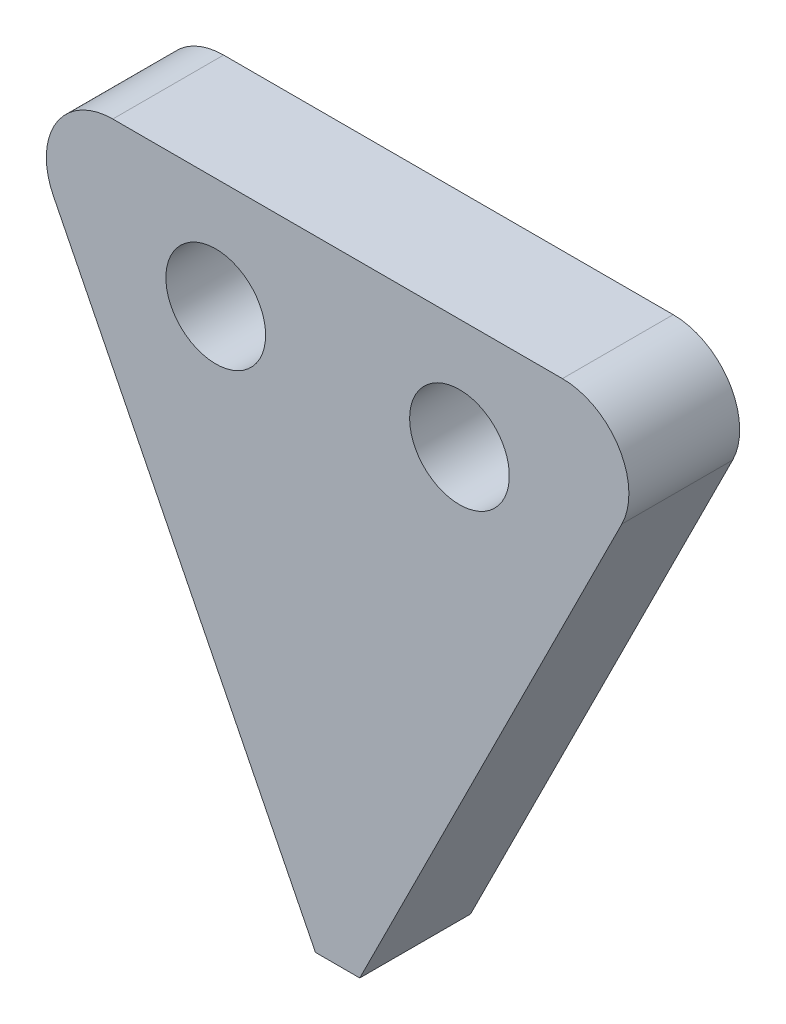
ISO-10303-21;
HEADER;
FILE_DESCRIPTION(('STEP AP214'),'2;1');
FILE_NAME('part.step','',(''),(''),'','','');
FILE_SCHEMA(('AUTOMOTIVE_DESIGN { 1 0 10303 214 1 1 1 1 }'));
ENDSEC;
DATA;
#1=APPLICATION_CONTEXT('core data for automotive mechanical design processes');
#2=APPLICATION_PROTOCOL_DEFINITION('international standard','automotive_design',2000,#1);
#3=PRODUCT_CONTEXT('',#1,'mechanical');
#4=PRODUCT('Part','Part','',(#3));
#5=PRODUCT_RELATED_PRODUCT_CATEGORY('part','',(#4));
#6=PRODUCT_DEFINITION_FORMATION('','',#4);
#7=PRODUCT_DEFINITION_CONTEXT('part definition',#1,'design');
#8=PRODUCT_DEFINITION('design','',#6,#7);
#9=PRODUCT_DEFINITION_SHAPE('','',#8);
#10=(LENGTH_UNIT() NAMED_UNIT(*) SI_UNIT(.MILLI.,.METRE.));
#11=(NAMED_UNIT(*) PLANE_ANGLE_UNIT() SI_UNIT($,.RADIAN.));
#12=(NAMED_UNIT(*) SI_UNIT($,.STERADIAN.) SOLID_ANGLE_UNIT());
#13=UNCERTAINTY_MEASURE_WITH_UNIT(LENGTH_MEASURE(1.E-05),#10,'distance_accuracy_value','');
#14=(GEOMETRIC_REPRESENTATION_CONTEXT(3) GLOBAL_UNCERTAINTY_ASSIGNED_CONTEXT((#13)) GLOBAL_UNIT_ASSIGNED_CONTEXT((#10,
#11,#12)) REPRESENTATION_CONTEXT('',''));
#15=CARTESIAN_POINT('',(0.,0.,0.));
#16=DIRECTION('',(0.,0.,1.));
#17=DIRECTION('',(1.,0.,0.));
#18=AXIS2_PLACEMENT_3D('',#15,#16,#17);
#19=CARTESIAN_POINT('',(-5.5,-5.,0.));
#20=DIRECTION('',(0.,0.,1.));
#21=DIRECTION('',(1.,0.,0.));
#22=AXIS2_PLACEMENT_3D('',#19,#20,#21);
#23=CYLINDRICAL_SURFACE('',#22,2.25);
#24=CARTESIAN_POINT('',(-5.5,-5.,0.));
#25=DIRECTION('',(0.,0.,1.));
#26=DIRECTION('',(1.,0.,0.));
#27=AXIS2_PLACEMENT_3D('',#24,#25,#26);
#28=CIRCLE('',#27,2.25);
#29=CARTESIAN_POINT('',(-3.25,-5.,0.));
#30=VERTEX_POINT('',#29);
#31=EDGE_CURVE('E25',#30,#30,#28,.T.);
#32=ORIENTED_EDGE('',*,*,#31,.F.);
#33=EDGE_LOOP('',(#32));
#34=FACE_BOUND('',#33,.T.);
#35=CARTESIAN_POINT('',(-5.5,-5.,5.));
#36=DIRECTION('',(0.,0.,1.));
#37=DIRECTION('',(1.,0.,0.));
#38=AXIS2_PLACEMENT_3D('',#35,#36,#37);
#39=CIRCLE('',#38,2.25);
#40=CARTESIAN_POINT('',(-3.25,-5.,5.));
#41=VERTEX_POINT('',#40);
#42=EDGE_CURVE('E130',#41,#41,#39,.T.);
#43=ORIENTED_EDGE('',*,*,#42,.T.);
#44=EDGE_LOOP('',(#43));
#45=FACE_BOUND('',#44,.T.);
#46=ADVANCED_FACE('F17',(#34,#45),#23,.F.);
#47=CARTESIAN_POINT('',(5.5,-5.,0.));
#48=DIRECTION('',(0.,0.,1.));
#49=DIRECTION('',(1.,0.,0.));
#50=AXIS2_PLACEMENT_3D('',#47,#48,#49);
#51=CYLINDRICAL_SURFACE('',#50,2.25);
#52=CARTESIAN_POINT('',(5.5,-5.,0.));
#53=DIRECTION('',(0.,0.,1.));
#54=DIRECTION('',(-1.,0.,0.));
#55=AXIS2_PLACEMENT_3D('',#52,#53,#54);
#56=CIRCLE('',#55,2.25);
#57=CARTESIAN_POINT('',(3.25,-5.,0.));
#58=VERTEX_POINT('',#57);
#59=EDGE_CURVE('E11',#58,#58,#56,.T.);
#60=ORIENTED_EDGE('',*,*,#59,.F.);
#61=EDGE_LOOP('',(#60));
#62=FACE_BOUND('',#61,.T.);
#63=CARTESIAN_POINT('',(5.5,-5.,5.));
#64=DIRECTION('',(0.,0.,1.));
#65=DIRECTION('',(-1.,0.,0.));
#66=AXIS2_PLACEMENT_3D('',#63,#64,#65);
#67=CIRCLE('',#66,2.25);
#68=CARTESIAN_POINT('',(3.25,-5.,5.));
#69=VERTEX_POINT('',#68);
#70=EDGE_CURVE('E125',#69,#69,#67,.T.);
#71=ORIENTED_EDGE('',*,*,#70,.T.);
#72=EDGE_LOOP('',(#71));
#73=FACE_BOUND('',#72,.T.);
#74=ADVANCED_FACE('F144',(#62,#73),#51,.F.);
#75=CARTESIAN_POINT('',(-3.05515476896272,-28.,0.));
#76=DIRECTION('',(0.,1.,0.));
#77=DIRECTION('',(1.,0.,0.));
#78=AXIS2_PLACEMENT_3D('',#75,#76,#77);
#79=PLANE('',#78);
#80=DIRECTION('',(-1.,0.,0.));
#81=VECTOR('',#80,1.);
#82=CARTESIAN_POINT('',(0.,-28.,0.));
#83=LINE('',#82,#81);
#84=CARTESIAN_POINT('',(1.,-28.,0.));
#85=VERTEX_POINT('',#84);
#86=CARTESIAN_POINT('',(-1.,-28.,0.));
#87=VERTEX_POINT('',#86);
#88=EDGE_CURVE('E129',#85,#87,#83,.T.);
#89=ORIENTED_EDGE('',*,*,#88,.F.);
#90=DIRECTION('',(0.,0.,-1.));
#91=VECTOR('',#90,1.);
#92=CARTESIAN_POINT('',(1.,-28.,5.));
#93=LINE('',#92,#91);
#94=CARTESIAN_POINT('',(1.,-28.,5.));
#95=VERTEX_POINT('',#94);
#96=EDGE_CURVE('E161',#95,#85,#93,.T.);
#97=ORIENTED_EDGE('',*,*,#96,.F.);
#98=DIRECTION('',(-1.,0.,0.));
#99=VECTOR('',#98,1.);
#100=CARTESIAN_POINT('',(-3.05515476896272,-28.,5.));
#101=LINE('',#100,#99);
#102=CARTESIAN_POINT('',(-1.,-28.,5.));
#103=VERTEX_POINT('',#102);
#104=EDGE_CURVE('E105',#95,#103,#101,.T.);
#105=ORIENTED_EDGE('',*,*,#104,.T.);
#106=DIRECTION('',(0.,0.,1.));
#107=VECTOR('',#106,1.);
#108=CARTESIAN_POINT('',(-1.,-28.,5.));
#109=LINE('',#108,#107);
#110=EDGE_CURVE('E182',#87,#103,#109,.T.);
#111=ORIENTED_EDGE('',*,*,#110,.F.);
#112=EDGE_LOOP('',(#89,#97,#105,#111));
#113=FACE_BOUND('',#112,.T.);
#114=ADVANCED_FACE('F183',(#113),#79,.F.);
#115=CARTESIAN_POINT('',(10.1458980337503,-3.,5.));
#116=DIRECTION('',(0.,0.,-1.));
#117=DIRECTION('',(-1.,0.,0.));
#118=AXIS2_PLACEMENT_3D('',#115,#116,#117);
#119=CYLINDRICAL_SURFACE('',#118,3.);
#120=CARTESIAN_POINT('',(10.1458980337503,-3.,5.));
#121=DIRECTION('',(0.,0.,1.));
#122=DIRECTION('',(1.,0.,0.));
#123=AXIS2_PLACEMENT_3D('',#120,#121,#122);
#124=CIRCLE('',#123,3.);
#125=CARTESIAN_POINT('',(12.8291796067501,-4.34164078649988,5.));
#126=VERTEX_POINT('',#125);
#127=CARTESIAN_POINT('',(10.1458980337503,0.,5.));
#128=VERTEX_POINT('',#127);
#129=EDGE_CURVE('E38',#126,#128,#124,.T.);
#130=ORIENTED_EDGE('',*,*,#129,.F.);
#131=DIRECTION('',(0.,0.,1.));
#132=VECTOR('',#131,1.);
#133=CARTESIAN_POINT('',(12.8291796067501,-4.34164078649987,5.));
#134=LINE('',#133,#132);
#135=CARTESIAN_POINT('',(12.8291796067501,-4.34164078649988,0.));
#136=VERTEX_POINT('',#135);
#137=EDGE_CURVE('E90',#136,#126,#134,.T.);
#138=ORIENTED_EDGE('',*,*,#137,.F.);
#139=CARTESIAN_POINT('',(10.1458980337503,-3.,0.));
#140=DIRECTION('',(0.,0.,-1.));
#141=DIRECTION('',(1.,0.,0.));
#142=AXIS2_PLACEMENT_3D('',#139,#140,#141);
#143=CIRCLE('',#142,3.);
#144=CARTESIAN_POINT('',(10.1458980337503,0.,0.));
#145=VERTEX_POINT('',#144);
#146=EDGE_CURVE('E84',#145,#136,#143,.T.);
#147=ORIENTED_EDGE('',*,*,#146,.F.);
#148=DIRECTION('',(0.,0.,-1.));
#149=VECTOR('',#148,1.);
#150=CARTESIAN_POINT('',(10.1458980337503,0.,5.));
#151=LINE('',#150,#149);
#152=EDGE_CURVE('E87',#128,#145,#151,.T.);
#153=ORIENTED_EDGE('',*,*,#152,.F.);
#154=EDGE_LOOP('',(#130,#138,#147,#153));
#155=FACE_BOUND('',#154,.T.);
#156=ADVANCED_FACE('F86',(#155),#119,.T.);
#157=CARTESIAN_POINT('',(-10.1458980337503,-3.,5.));
#158=DIRECTION('',(0.,0.,-1.));
#159=DIRECTION('',(-1.,0.,0.));
#160=AXIS2_PLACEMENT_3D('',#157,#158,#159);
#161=CYLINDRICAL_SURFACE('',#160,3.);
#162=CARTESIAN_POINT('',(-10.1458980337503,-3.,5.));
#163=DIRECTION('',(0.,0.,1.));
#164=DIRECTION('',(1.,0.,0.));
#165=AXIS2_PLACEMENT_3D('',#162,#163,#164);
#166=CIRCLE('',#165,3.);
#167=CARTESIAN_POINT('',(-10.1458980337503,0.,5.));
#168=VERTEX_POINT('',#167);
#169=CARTESIAN_POINT('',(-12.8291796067501,-4.34164078649988,5.));
#170=VERTEX_POINT('',#169);
#171=EDGE_CURVE('E52',#168,#170,#166,.T.);
#172=ORIENTED_EDGE('',*,*,#171,.F.);
#173=DIRECTION('',(0.,0.,1.));
#174=VECTOR('',#173,1.);
#175=CARTESIAN_POINT('',(-10.1458980337503,0.,5.));
#176=LINE('',#175,#174);
#177=CARTESIAN_POINT('',(-10.1458980337503,0.,0.));
#178=VERTEX_POINT('',#177);
#179=EDGE_CURVE('E111',#178,#168,#176,.T.);
#180=ORIENTED_EDGE('',*,*,#179,.F.);
#181=CARTESIAN_POINT('',(-10.1458980337503,-3.,0.));
#182=DIRECTION('',(0.,0.,-1.));
#183=DIRECTION('',(1.,0.,0.));
#184=AXIS2_PLACEMENT_3D('',#181,#182,#183);
#185=CIRCLE('',#184,3.);
#186=CARTESIAN_POINT('',(-12.8291796067501,-4.34164078649988,0.));
#187=VERTEX_POINT('',#186);
#188=EDGE_CURVE('E96',#187,#178,#185,.T.);
#189=ORIENTED_EDGE('',*,*,#188,.F.);
#190=DIRECTION('',(0.,0.,-1.));
#191=VECTOR('',#190,1.);
#192=CARTESIAN_POINT('',(-12.8291796067501,-4.34164078649988,5.));
#193=LINE('',#192,#191);
#194=EDGE_CURVE('E162',#170,#187,#193,.T.);
#195=ORIENTED_EDGE('',*,*,#194,.F.);
#196=EDGE_LOOP('',(#172,#180,#189,#195));
#197=FACE_BOUND('',#196,.T.);
#198=ADVANCED_FACE('F202',(#197),#161,.T.);
#199=CARTESIAN_POINT('',(0.,0.,0.));
#200=DIRECTION('',(0.,0.,1.));
#201=DIRECTION('',(1.,0.,0.));
#202=AXIS2_PLACEMENT_3D('',#199,#200,#201);
#203=PLANE('',#202);
#204=ORIENTED_EDGE('',*,*,#59,.T.);
#205=EDGE_LOOP('',(#204));
#206=FACE_BOUND('',#205,.T.);
#207=ORIENTED_EDGE('',*,*,#31,.T.);
#208=EDGE_LOOP('',(#207));
#209=FACE_BOUND('',#208,.T.);
#210=DIRECTION('',(0.447213595499958,0.894427190999916,0.));
#211=VECTOR('',#210,1.);
#212=CARTESIAN_POINT('',(0.,-30.,0.));
#213=LINE('',#212,#211);
#214=EDGE_CURVE('E119',#85,#136,#213,.T.);
#215=ORIENTED_EDGE('',*,*,#214,.F.);
#216=ORIENTED_EDGE('',*,*,#88,.T.);
#217=DIRECTION('',(0.447213595499958,-0.894427190999916,0.));
#218=VECTOR('',#217,1.);
#219=CARTESIAN_POINT('',(-15.,0.,0.));
#220=LINE('',#219,#218);
#221=EDGE_CURVE('E179',#187,#87,#220,.T.);
#222=ORIENTED_EDGE('',*,*,#221,.F.);
#223=ORIENTED_EDGE('',*,*,#188,.T.);
#224=DIRECTION('',(-1.,0.,0.));
#225=VECTOR('',#224,1.);
#226=CARTESIAN_POINT('',(-15.,0.,0.));
#227=LINE('',#226,#225);
#228=EDGE_CURVE('E102',#145,#178,#227,.T.);
#229=ORIENTED_EDGE('',*,*,#228,.F.);
#230=ORIENTED_EDGE('',*,*,#146,.T.);
#231=EDGE_LOOP('',(#215,#216,#222,#223,#229,#230));
#232=FACE_BOUND('',#231,.T.);
#233=ADVANCED_FACE('F107',(#206,#209,#232),#203,.F.);
#234=CARTESIAN_POINT('',(0.,0.,5.));
#235=DIRECTION('',(0.,0.,1.));
#236=DIRECTION('',(1.,0.,0.));
#237=AXIS2_PLACEMENT_3D('',#234,#235,#236);
#238=PLANE('',#237);
#239=ORIENTED_EDGE('',*,*,#70,.F.);
#240=EDGE_LOOP('',(#239));
#241=FACE_BOUND('',#240,.T.);
#242=ORIENTED_EDGE('',*,*,#42,.F.);
#243=EDGE_LOOP('',(#242));
#244=FACE_BOUND('',#243,.T.);
#245=ORIENTED_EDGE('',*,*,#104,.F.);
#246=DIRECTION('',(0.447213595499958,0.894427190999916,0.));
#247=VECTOR('',#246,1.);
#248=CARTESIAN_POINT('',(0.,-30.,5.));
#249=LINE('',#248,#247);
#250=EDGE_CURVE('E158',#95,#126,#249,.T.);
#251=ORIENTED_EDGE('',*,*,#250,.T.);
#252=ORIENTED_EDGE('',*,*,#129,.T.);
#253=DIRECTION('',(-1.,0.,0.));
#254=VECTOR('',#253,1.);
#255=CARTESIAN_POINT('',(-15.,0.,5.));
#256=LINE('',#255,#254);
#257=EDGE_CURVE('E103',#128,#168,#256,.T.);
#258=ORIENTED_EDGE('',*,*,#257,.T.);
#259=ORIENTED_EDGE('',*,*,#171,.T.);
#260=DIRECTION('',(0.447213595499958,-0.894427190999916,0.));
#261=VECTOR('',#260,1.);
#262=CARTESIAN_POINT('',(-15.,0.,5.));
#263=LINE('',#262,#261);
#264=EDGE_CURVE('E156',#170,#103,#263,.T.);
#265=ORIENTED_EDGE('',*,*,#264,.T.);
#266=EDGE_LOOP('',(#245,#251,#252,#258,#259,#265));
#267=FACE_BOUND('',#266,.T.);
#268=ADVANCED_FACE('F201',(#241,#244,#267),#238,.T.);
#269=CARTESIAN_POINT('',(-15.,0.,5.));
#270=DIRECTION('',(0.,-1.,0.));
#271=DIRECTION('',(0.,0.,-1.));
#272=AXIS2_PLACEMENT_3D('',#269,#270,#271);
#273=PLANE('',#272);
#274=ORIENTED_EDGE('',*,*,#228,.T.);
#275=ORIENTED_EDGE('',*,*,#179,.T.);
#276=ORIENTED_EDGE('',*,*,#257,.F.);
#277=ORIENTED_EDGE('',*,*,#152,.T.);
#278=EDGE_LOOP('',(#274,#275,#276,#277));
#279=FACE_BOUND('',#278,.T.);
#280=ADVANCED_FACE('F100',(#279),#273,.F.);
#281=CARTESIAN_POINT('',(0.,-30.,5.));
#282=DIRECTION('',(-0.894427190999916,0.447213595499958,0.));
#283=DIRECTION('',(0.,0.,1.));
#284=AXIS2_PLACEMENT_3D('',#281,#282,#283);
#285=PLANE('',#284);
#286=ORIENTED_EDGE('',*,*,#250,.F.);
#287=ORIENTED_EDGE('',*,*,#96,.T.);
#288=ORIENTED_EDGE('',*,*,#214,.T.);
#289=ORIENTED_EDGE('',*,*,#137,.T.);
#290=EDGE_LOOP('',(#286,#287,#288,#289));
#291=FACE_BOUND('',#290,.T.);
#292=ADVANCED_FACE('F174',(#291),#285,.F.);
#293=CARTESIAN_POINT('',(-15.,0.,5.));
#294=DIRECTION('',(0.894427190999916,0.447213595499958,0.));
#295=DIRECTION('',(0.,0.,-1.));
#296=AXIS2_PLACEMENT_3D('',#293,#294,#295);
#297=PLANE('',#296);
#298=ORIENTED_EDGE('',*,*,#221,.T.);
#299=ORIENTED_EDGE('',*,*,#110,.T.);
#300=ORIENTED_EDGE('',*,*,#264,.F.);
#301=ORIENTED_EDGE('',*,*,#194,.T.);
#302=EDGE_LOOP('',(#298,#299,#300,#301));
#303=FACE_BOUND('',#302,.T.);
#304=ADVANCED_FACE('F189',(#303),#297,.F.);
#305=CLOSED_SHELL('',(#46,#74,#114,#156,#198,#233,#268,#280,#292,#304));
#306=MANIFOLD_SOLID_BREP('B1',#305);
#307=ADVANCED_BREP_SHAPE_REPRESENTATION('',(#18,#306),#14);
#308=SHAPE_DEFINITION_REPRESENTATION(#9,#307);
ENDSEC;
END-ISO-10303-21;
